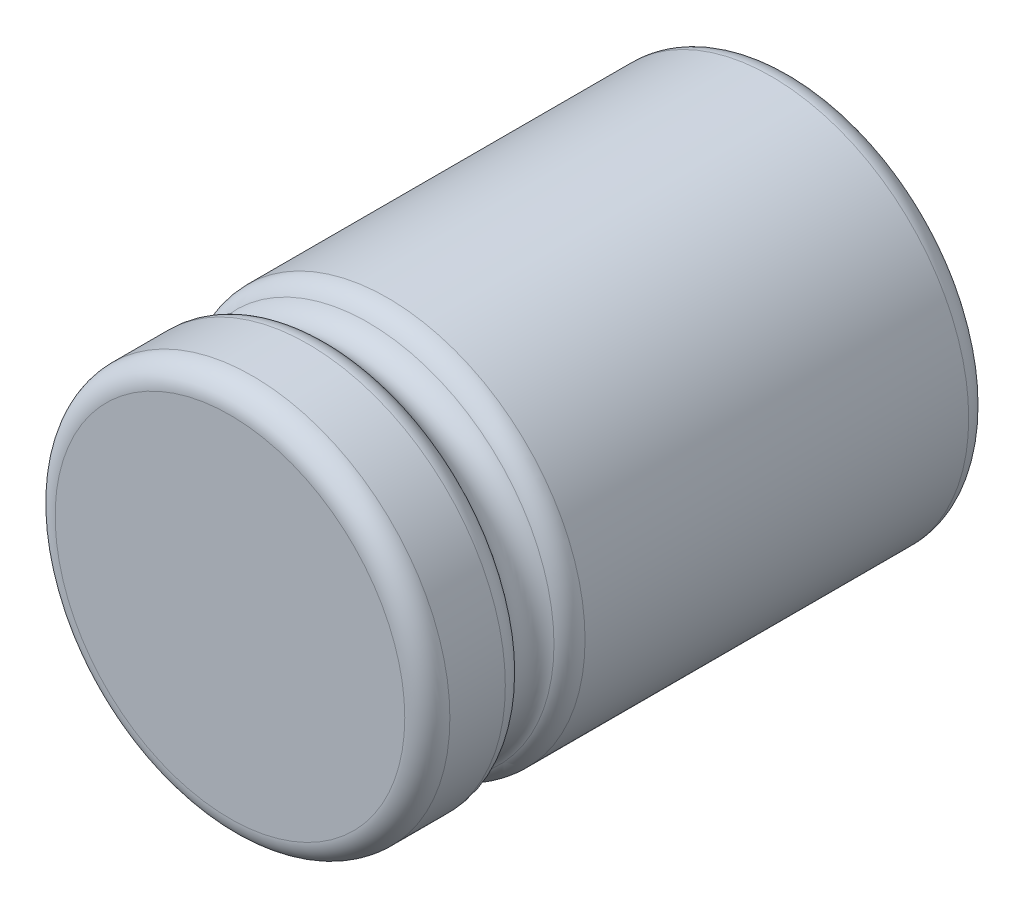
ISO-10303-21;
HEADER;
FILE_DESCRIPTION(('STEP AP214'),'2;1');
FILE_NAME('part.step','',(''),(''),'','','');
FILE_SCHEMA(('AUTOMOTIVE_DESIGN { 1 0 10303 214 1 1 1 1 }'));
ENDSEC;
DATA;
#1=APPLICATION_CONTEXT('core data for automotive mechanical design processes');
#2=APPLICATION_PROTOCOL_DEFINITION('international standard','automotive_design',2000,#1);
#3=PRODUCT_CONTEXT('',#1,'mechanical');
#4=PRODUCT('Part','Part','',(#3));
#5=PRODUCT_RELATED_PRODUCT_CATEGORY('part','',(#4));
#6=PRODUCT_DEFINITION_FORMATION('','',#4);
#7=PRODUCT_DEFINITION_CONTEXT('part definition',#1,'design');
#8=PRODUCT_DEFINITION('design','',#6,#7);
#9=PRODUCT_DEFINITION_SHAPE('','',#8);
#10=(LENGTH_UNIT() NAMED_UNIT(*) SI_UNIT(.MILLI.,.METRE.));
#11=(NAMED_UNIT(*) PLANE_ANGLE_UNIT() SI_UNIT($,.RADIAN.));
#12=(NAMED_UNIT(*) SI_UNIT($,.STERADIAN.) SOLID_ANGLE_UNIT());
#13=UNCERTAINTY_MEASURE_WITH_UNIT(LENGTH_MEASURE(1.E-05),#10,'distance_accuracy_value','');
#14=(GEOMETRIC_REPRESENTATION_CONTEXT(3) GLOBAL_UNCERTAINTY_ASSIGNED_CONTEXT((#13)) GLOBAL_UNIT_ASSIGNED_CONTEXT((#10,
#11,#12)) REPRESENTATION_CONTEXT('',''));
#15=CARTESIAN_POINT('',(0.,0.,0.));
#16=DIRECTION('',(0.,0.,1.));
#17=DIRECTION('',(1.,0.,0.));
#18=AXIS2_PLACEMENT_3D('',#15,#16,#17);
#19=CARTESIAN_POINT('',(0.,0.,50.));
#20=DIRECTION('',(0.,0.,-1.));
#21=DIRECTION('',(-1.,0.,0.));
#22=AXIS2_PLACEMENT_3D('',#19,#20,#21);
#23=CYLINDRICAL_SURFACE('',#22,17.5);
#24=CARTESIAN_POINT('',(0.,0.,36.0159413837297));
#25=DIRECTION('',(0.,0.,-1.));
#26=DIRECTION('',(-1.,0.,0.));
#27=AXIS2_PLACEMENT_3D('',#24,#25,#26);
#28=CIRCLE('',#27,17.5);
#29=CARTESIAN_POINT('',(17.5,0.,36.0159413837297));
#30=VERTEX_POINT('',#29);
#31=EDGE_CURVE('E11',#30,#30,#28,.T.);
#32=ORIENTED_EDGE('',*,*,#31,.T.);
#33=EDGE_LOOP('',(#32));
#34=FACE_BOUND('',#33,.T.);
#35=CARTESIAN_POINT('',(0.,0.,2.));
#36=DIRECTION('',(0.,0.,1.));
#37=DIRECTION('',(1.,0.,0.));
#38=AXIS2_PLACEMENT_3D('',#35,#36,#37);
#39=CIRCLE('',#38,17.5);
#40=CARTESIAN_POINT('',(17.5,0.,2.));
#41=VERTEX_POINT('',#40);
#42=EDGE_CURVE('E83',#41,#41,#39,.T.);
#43=ORIENTED_EDGE('',*,*,#42,.T.);
#44=EDGE_LOOP('',(#43));
#45=FACE_BOUND('',#44,.T.);
#46=ADVANCED_FACE('F37',(#34,#45),#23,.T.);
#47=CARTESIAN_POINT('',(0.,0.,0.));
#48=DIRECTION('',(0.,0.,1.));
#49=DIRECTION('',(1.,0.,0.));
#50=AXIS2_PLACEMENT_3D('',#47,#48,#49);
#51=PLANE('',#50);
#52=CARTESIAN_POINT('',(0.,0.,0.));
#53=DIRECTION('',(0.,0.,1.));
#54=DIRECTION('',(1.,0.,0.));
#55=AXIS2_PLACEMENT_3D('',#52,#53,#54);
#56=CIRCLE('',#55,15.5);
#57=CARTESIAN_POINT('',(15.5,0.,0.));
#58=VERTEX_POINT('',#57);
#59=EDGE_CURVE('E77',#58,#58,#56,.F.);
#60=ORIENTED_EDGE('',*,*,#59,.T.);
#61=EDGE_LOOP('',(#60));
#62=FACE_BOUND('',#61,.T.);
#63=ADVANCED_FACE('F108',(#62),#51,.F.);
#64=CARTESIAN_POINT('',(0.,0.,2.));
#65=DIRECTION('',(0.,0.,1.));
#66=DIRECTION('',(1.,0.,0.));
#67=AXIS2_PLACEMENT_3D('',#64,#65,#66);
#68=TOROIDAL_SURFACE('',#67,15.5,2.);
#69=ORIENTED_EDGE('',*,*,#59,.F.);
#70=EDGE_LOOP('',(#69));
#71=FACE_BOUND('',#70,.T.);
#72=ORIENTED_EDGE('',*,*,#42,.F.);
#73=EDGE_LOOP('',(#72));
#74=FACE_BOUND('',#73,.T.);
#75=ADVANCED_FACE('F113',(#71,#74),#68,.T.);
#76=CARTESIAN_POINT('',(0.,0.,39.5504350035161));
#77=DIRECTION('',(0.,0.,-1.));
#78=DIRECTION('',(-1.,0.,0.));
#79=AXIS2_PLACEMENT_3D('',#76,#77,#78);
#80=TOROIDAL_SURFACE('',#79,17.5,2.06111378174889);
#81=CARTESIAN_POINT('',(17.5,0.,39.5504350035161));
#82=DIRECTION('',(0.,1.,0.));
#83=DIRECTION('',(0.,0.,1.));
#84=AXIS2_PLACEMENT_3D('',#81,#82,#83);
#85=CIRCLE('',#84,2.06111378174889);
#86=CARTESIAN_POINT('',(16.4849514726666,0.,37.7565937316992));
#87=VERTEX_POINT('',#86);
#88=CARTESIAN_POINT('',(16.4849514726666,0.,41.344276275333));
#89=VERTEX_POINT('',#88);
#90=EDGE_CURVE('E66',#87,#89,#85,.T.);
#91=ORIENTED_EDGE('',*,*,#90,.T.);
#92=CARTESIAN_POINT('',(0.,0.,41.344276275333));
#93=DIRECTION('',(0.,0.,-1.));
#94=DIRECTION('',(-1.,0.,0.));
#95=AXIS2_PLACEMENT_3D('',#92,#93,#94);
#96=CIRCLE('',#95,16.4849514726665);
#97=EDGE_CURVE('E73',#89,#89,#96,.T.);
#98=ORIENTED_EDGE('',*,*,#97,.T.);
#99=ORIENTED_EDGE('',*,*,#90,.F.);
#100=CARTESIAN_POINT('',(0.,0.,37.7565937316992));
#101=DIRECTION('',(0.,0.,1.));
#102=DIRECTION('',(1.,0.,0.));
#103=AXIS2_PLACEMENT_3D('',#100,#101,#102);
#104=CIRCLE('',#103,16.4849514726665);
#105=EDGE_CURVE('E65',#87,#87,#104,.T.);
#106=ORIENTED_EDGE('',*,*,#105,.T.);
#107=EDGE_LOOP('',(#91,#98,#99,#106));
#108=FACE_BOUND('',#107,.T.);
#109=ADVANCED_FACE('F103',(#108),#80,.F.);
#110=CARTESIAN_POINT('',(0.,0.,50.));
#111=DIRECTION('',(0.,0.,1.));
#112=DIRECTION('',(1.,0.,0.));
#113=AXIS2_PLACEMENT_3D('',#110,#111,#112);
#114=PLANE('',#113);
#115=CARTESIAN_POINT('',(0.,0.,50.));
#116=DIRECTION('',(0.,0.,1.));
#117=DIRECTION('',(1.,0.,0.));
#118=AXIS2_PLACEMENT_3D('',#115,#116,#117);
#119=CIRCLE('',#118,15.5);
#120=CARTESIAN_POINT('',(15.5,0.,50.));
#121=VERTEX_POINT('',#120);
#122=EDGE_CURVE('E68',#121,#121,#119,.T.);
#123=ORIENTED_EDGE('',*,*,#122,.T.);
#124=EDGE_LOOP('',(#123));
#125=FACE_BOUND('',#124,.T.);
#126=ADVANCED_FACE('F89',(#125),#114,.T.);
#127=CARTESIAN_POINT('',(0.,0.,48.));
#128=DIRECTION('',(0.,0.,1.));
#129=DIRECTION('',(1.,0.,0.));
#130=AXIS2_PLACEMENT_3D('',#127,#128,#129);
#131=TOROIDAL_SURFACE('',#130,15.5,2.);
#132=CARTESIAN_POINT('',(0.,0.,48.));
#133=DIRECTION('',(0.,0.,1.));
#134=DIRECTION('',(1.,0.,0.));
#135=AXIS2_PLACEMENT_3D('',#132,#133,#134);
#136=CIRCLE('',#135,17.5);
#137=CARTESIAN_POINT('',(17.5,0.,48.));
#138=VERTEX_POINT('',#137);
#139=EDGE_CURVE('E80',#138,#138,#136,.F.);
#140=ORIENTED_EDGE('',*,*,#139,.F.);
#141=EDGE_LOOP('',(#140));
#142=FACE_BOUND('',#141,.T.);
#143=ORIENTED_EDGE('',*,*,#122,.F.);
#144=EDGE_LOOP('',(#143));
#145=FACE_BOUND('',#144,.T.);
#146=ADVANCED_FACE('F91',(#142,#145),#131,.T.);
#147=CARTESIAN_POINT('',(0.,0.,43.0849286233025));
#148=DIRECTION('',(0.,0.,1.));
#149=DIRECTION('',(1.,0.,0.));
#150=AXIS2_PLACEMENT_3D('',#147,#148,#149);
#151=CIRCLE('',#150,17.5);
#152=CARTESIAN_POINT('',(17.5,0.,43.0849286233025));
#153=VERTEX_POINT('',#152);
#154=EDGE_CURVE('E46',#153,#153,#151,.T.);
#155=ORIENTED_EDGE('',*,*,#154,.T.);
#156=EDGE_LOOP('',(#155));
#157=FACE_BOUND('',#156,.T.);
#158=ORIENTED_EDGE('',*,*,#139,.T.);
#159=EDGE_LOOP('',(#158));
#160=FACE_BOUND('',#159,.T.);
#161=ADVANCED_FACE('F93',(#157,#160),#23,.T.);
#162=CARTESIAN_POINT('',(0.,0.,43.0849286233025));
#163=DIRECTION('',(0.,0.,1.));
#164=DIRECTION('',(1.,0.,0.));
#165=AXIS2_PLACEMENT_3D('',#162,#163,#164);
#166=TOROIDAL_SURFACE('',#165,15.5,2.);
#167=CARTESIAN_POINT('',(15.5,0.,43.0849286233025));
#168=DIRECTION('',(0.,1.,0.));
#169=DIRECTION('',(0.,0.,1.));
#170=AXIS2_PLACEMENT_3D('',#167,#168,#169);
#171=CIRCLE('',#170,2.);
#172=EDGE_CURVE('E60',#153,#89,#171,.T.);
#173=ORIENTED_EDGE('',*,*,#172,.F.);
#174=ORIENTED_EDGE('',*,*,#154,.F.);
#175=ORIENTED_EDGE('',*,*,#172,.T.);
#176=ORIENTED_EDGE('',*,*,#97,.F.);
#177=EDGE_LOOP('',(#173,#174,#175,#176));
#178=FACE_BOUND('',#177,.T.);
#179=ADVANCED_FACE('F100',(#178),#166,.T.);
#180=CARTESIAN_POINT('',(0.,0.,36.0159413837297));
#181=DIRECTION('',(0.,0.,-1.));
#182=DIRECTION('',(-1.,0.,0.));
#183=AXIS2_PLACEMENT_3D('',#180,#181,#182);
#184=TOROIDAL_SURFACE('',#183,15.5,2.);
#185=CARTESIAN_POINT('',(15.5,0.,36.0159413837297));
#186=DIRECTION('',(0.,-1.,0.));
#187=DIRECTION('',(0.,0.,-1.));
#188=AXIS2_PLACEMENT_3D('',#185,#186,#187);
#189=CIRCLE('',#188,2.);
#190=EDGE_CURVE('E41',#30,#87,#189,.T.);
#191=ORIENTED_EDGE('',*,*,#190,.F.);
#192=ORIENTED_EDGE('',*,*,#31,.F.);
#193=ORIENTED_EDGE('',*,*,#190,.T.);
#194=ORIENTED_EDGE('',*,*,#105,.F.);
#195=EDGE_LOOP('',(#191,#192,#193,#194));
#196=FACE_BOUND('',#195,.T.);
#197=ADVANCED_FACE('F39',(#196),#184,.T.);
#198=CLOSED_SHELL('',(#46,#63,#75,#109,#126,#146,#161,#179,#197));
#199=MANIFOLD_SOLID_BREP('B2',#198);
#200=ADVANCED_BREP_SHAPE_REPRESENTATION('',(#18,#199),#14);
#201=SHAPE_DEFINITION_REPRESENTATION(#9,#200);
ENDSEC;
END-ISO-10303-21;
